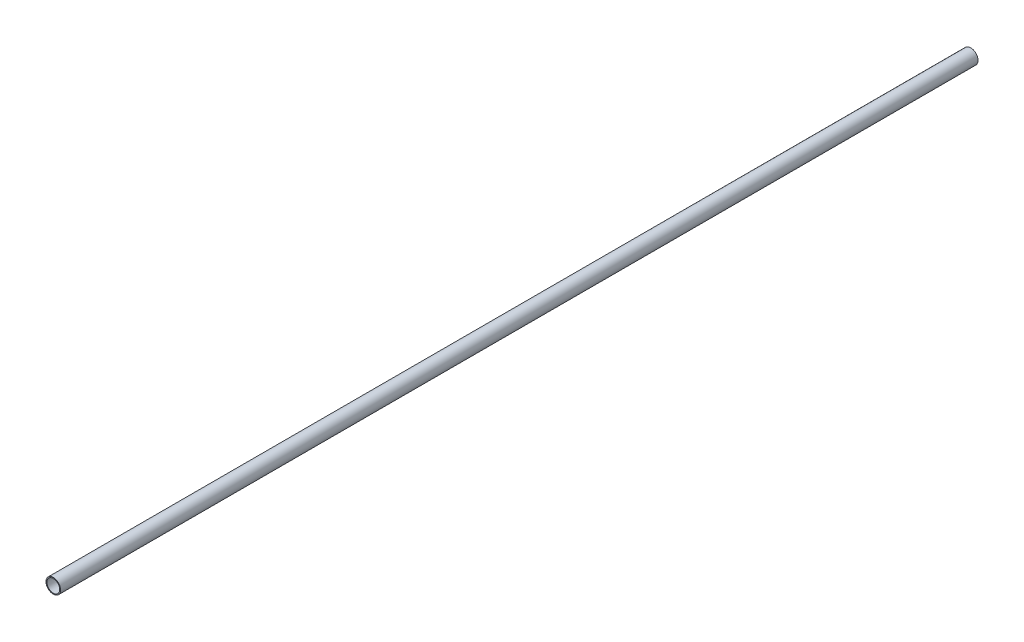
ISO-10303-21;
HEADER;
FILE_DESCRIPTION(('STEP AP214'),'2;1');
FILE_NAME('part.step','',(''),(''),'','','');
FILE_SCHEMA(('AUTOMOTIVE_DESIGN { 1 0 10303 214 1 1 1 1 }'));
ENDSEC;
DATA;
#1=APPLICATION_CONTEXT('core data for automotive mechanical design processes');
#2=APPLICATION_PROTOCOL_DEFINITION('international standard','automotive_design',2000,#1);
#3=PRODUCT_CONTEXT('',#1,'mechanical');
#4=PRODUCT('Part','Part','',(#3));
#5=PRODUCT_RELATED_PRODUCT_CATEGORY('part','',(#4));
#6=PRODUCT_DEFINITION_FORMATION('','',#4);
#7=PRODUCT_DEFINITION_CONTEXT('part definition',#1,'design');
#8=PRODUCT_DEFINITION('design','',#6,#7);
#9=PRODUCT_DEFINITION_SHAPE('','',#8);
#10=(LENGTH_UNIT() NAMED_UNIT(*) SI_UNIT(.MILLI.,.METRE.));
#11=(NAMED_UNIT(*) PLANE_ANGLE_UNIT() SI_UNIT($,.RADIAN.));
#12=(NAMED_UNIT(*) SI_UNIT($,.STERADIAN.) SOLID_ANGLE_UNIT());
#13=UNCERTAINTY_MEASURE_WITH_UNIT(LENGTH_MEASURE(1.E-05),#10,'distance_accuracy_value','');
#14=(GEOMETRIC_REPRESENTATION_CONTEXT(3) GLOBAL_UNCERTAINTY_ASSIGNED_CONTEXT((#13)) GLOBAL_UNIT_ASSIGNED_CONTEXT((#10,
#11,#12)) REPRESENTATION_CONTEXT('',''));
#15=CARTESIAN_POINT('',(0.,0.,0.));
#16=DIRECTION('',(0.,0.,1.));
#17=DIRECTION('',(1.,0.,0.));
#18=AXIS2_PLACEMENT_3D('',#15,#16,#17);
#19=CARTESIAN_POINT('',(155.331009868176,335.849590781825,1000.));
#20=DIRECTION('',(0.,0.,1.));
#21=DIRECTION('',(1.,0.,0.));
#22=AXIS2_PLACEMENT_3D('',#19,#20,#21);
#23=PLANE('',#22);
#24=CARTESIAN_POINT('',(155.331009868176,335.849590781825,1000.));
#25=DIRECTION('',(0.,0.,1.));
#26=DIRECTION('',(1.,0.,0.));
#27=AXIS2_PLACEMENT_3D('',#24,#25,#26);
#28=CIRCLE('',#27,7.95);
#29=CARTESIAN_POINT('',(163.281009868176,335.849590781825,1000.));
#30=VERTEX_POINT('',#29);
#31=EDGE_CURVE('E10',#30,#30,#28,.T.);
#32=ORIENTED_EDGE('',*,*,#31,.T.);
#33=EDGE_LOOP('',(#32));
#34=FACE_BOUND('',#33,.T.);
#35=CARTESIAN_POINT('',(155.331009868176,335.849590781825,1000.));
#36=DIRECTION('',(0.,0.,1.));
#37=DIRECTION('',(1.,0.,0.));
#38=AXIS2_PLACEMENT_3D('',#35,#36,#37);
#39=CIRCLE('',#38,6.95000000000001);
#40=CARTESIAN_POINT('',(162.281009868176,335.849590781825,1000.));
#41=VERTEX_POINT('',#40);
#42=EDGE_CURVE('E41',#41,#41,#39,.T.);
#43=ORIENTED_EDGE('',*,*,#42,.F.);
#44=EDGE_LOOP('',(#43));
#45=FACE_BOUND('',#44,.T.);
#46=ADVANCED_FACE('F30',(#34,#45),#23,.T.);
#47=CARTESIAN_POINT('',(155.331009868176,335.849590781825,0.));
#48=DIRECTION('',(0.,0.,1.));
#49=DIRECTION('',(1.,0.,0.));
#50=AXIS2_PLACEMENT_3D('',#47,#48,#49);
#51=PLANE('',#50);
#52=CARTESIAN_POINT('',(155.331009868176,335.849590781825,0.));
#53=DIRECTION('',(0.,0.,1.));
#54=DIRECTION('',(1.,0.,0.));
#55=AXIS2_PLACEMENT_3D('',#52,#53,#54);
#56=CIRCLE('',#55,7.95);
#57=CARTESIAN_POINT('',(163.281009868176,335.849590781825,0.));
#58=VERTEX_POINT('',#57);
#59=EDGE_CURVE('E34',#58,#58,#56,.T.);
#60=ORIENTED_EDGE('',*,*,#59,.F.);
#61=EDGE_LOOP('',(#60));
#62=FACE_BOUND('',#61,.T.);
#63=CARTESIAN_POINT('',(155.331009868176,335.849590781825,0.));
#64=DIRECTION('',(0.,0.,1.));
#65=DIRECTION('',(1.,0.,0.));
#66=AXIS2_PLACEMENT_3D('',#63,#64,#65);
#67=CIRCLE('',#66,6.95000000000001);
#68=CARTESIAN_POINT('',(162.281009868176,335.849590781825,0.));
#69=VERTEX_POINT('',#68);
#70=EDGE_CURVE('E43',#69,#69,#67,.T.);
#71=ORIENTED_EDGE('',*,*,#70,.T.);
#72=EDGE_LOOP('',(#71));
#73=FACE_BOUND('',#72,.T.);
#74=ADVANCED_FACE('F53',(#62,#73),#51,.F.);
#75=CARTESIAN_POINT('',(155.331009868176,335.849590781825,1000.));
#76=DIRECTION('',(0.,0.,-1.));
#77=DIRECTION('',(-1.,0.,0.));
#78=AXIS2_PLACEMENT_3D('',#75,#76,#77);
#79=CYLINDRICAL_SURFACE('',#78,7.95);
#80=ORIENTED_EDGE('',*,*,#31,.F.);
#81=EDGE_LOOP('',(#80));
#82=FACE_BOUND('',#81,.T.);
#83=ORIENTED_EDGE('',*,*,#59,.T.);
#84=EDGE_LOOP('',(#83));
#85=FACE_BOUND('',#84,.T.);
#86=ADVANCED_FACE('F32',(#82,#85),#79,.T.);
#87=CARTESIAN_POINT('',(155.331009868176,335.849590781825,1000.));
#88=DIRECTION('',(0.,0.,-1.));
#89=DIRECTION('',(-1.,0.,0.));
#90=AXIS2_PLACEMENT_3D('',#87,#88,#89);
#91=CYLINDRICAL_SURFACE('',#90,6.95000000000001);
#92=ORIENTED_EDGE('',*,*,#42,.T.);
#93=EDGE_LOOP('',(#92));
#94=FACE_BOUND('',#93,.T.);
#95=ORIENTED_EDGE('',*,*,#70,.F.);
#96=EDGE_LOOP('',(#95));
#97=FACE_BOUND('',#96,.T.);
#98=ADVANCED_FACE('F49',(#94,#97),#91,.F.);
#99=CLOSED_SHELL('',(#46,#74,#86,#98));
#100=MANIFOLD_SOLID_BREP('B2',#99);
#101=ADVANCED_BREP_SHAPE_REPRESENTATION('',(#18,#100),#14);
#102=SHAPE_DEFINITION_REPRESENTATION(#9,#101);
ENDSEC;
END-ISO-10303-21;
